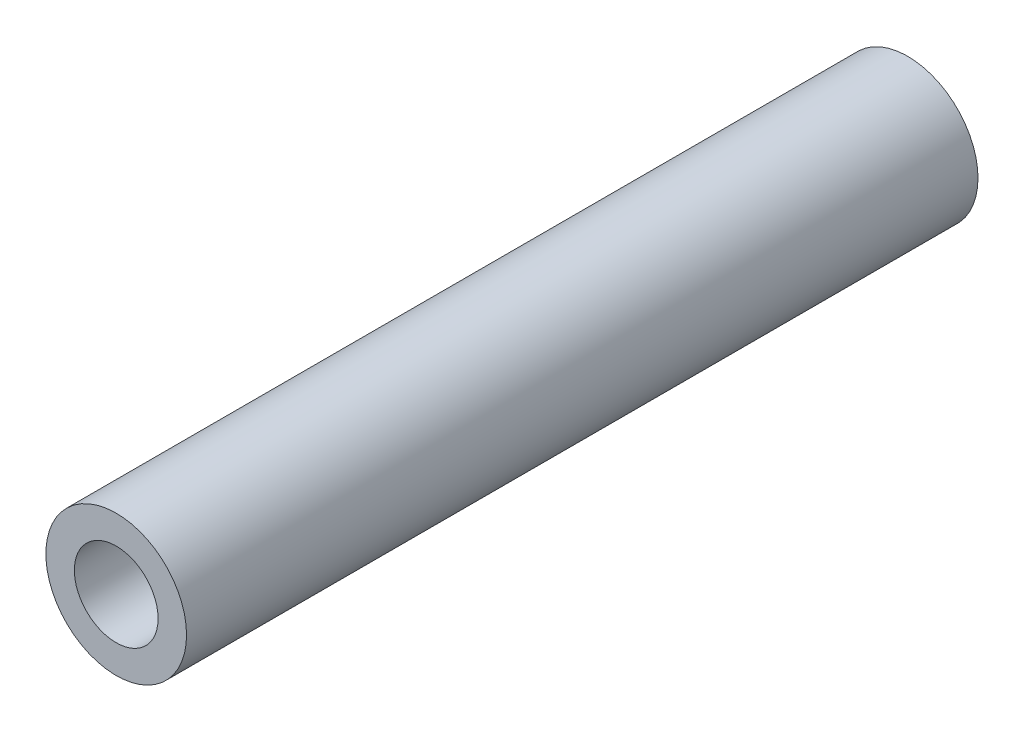
ISO-10303-21;
HEADER;
FILE_DESCRIPTION(('STEP AP214'),'2;1');
FILE_NAME('part.step','',(''),(''),'','','');
FILE_SCHEMA(('AUTOMOTIVE_DESIGN { 1 0 10303 214 1 1 1 1 }'));
ENDSEC;
DATA;
#1=APPLICATION_CONTEXT('core data for automotive mechanical design processes');
#2=APPLICATION_PROTOCOL_DEFINITION('international standard','automotive_design',2000,#1);
#3=PRODUCT_CONTEXT('',#1,'mechanical');
#4=PRODUCT('Part','Part','',(#3));
#5=PRODUCT_RELATED_PRODUCT_CATEGORY('part','',(#4));
#6=PRODUCT_DEFINITION_FORMATION('','',#4);
#7=PRODUCT_DEFINITION_CONTEXT('part definition',#1,'design');
#8=PRODUCT_DEFINITION('design','',#6,#7);
#9=PRODUCT_DEFINITION_SHAPE('','',#8);
#10=(LENGTH_UNIT() NAMED_UNIT(*) SI_UNIT(.MILLI.,.METRE.));
#11=(NAMED_UNIT(*) PLANE_ANGLE_UNIT() SI_UNIT($,.RADIAN.));
#12=(NAMED_UNIT(*) SI_UNIT($,.STERADIAN.) SOLID_ANGLE_UNIT());
#13=UNCERTAINTY_MEASURE_WITH_UNIT(LENGTH_MEASURE(1.E-05),#10,'distance_accuracy_value','');
#14=(GEOMETRIC_REPRESENTATION_CONTEXT(3) GLOBAL_UNCERTAINTY_ASSIGNED_CONTEXT((#13)) GLOBAL_UNIT_ASSIGNED_CONTEXT((#10,
#11,#12)) REPRESENTATION_CONTEXT('',''));
#15=CARTESIAN_POINT('',(0.,0.,0.));
#16=DIRECTION('',(0.,0.,1.));
#17=DIRECTION('',(1.,0.,0.));
#18=AXIS2_PLACEMENT_3D('',#15,#16,#17);
#19=CARTESIAN_POINT('',(0.,0.,120.));
#20=DIRECTION('',(0.,0.,1.));
#21=DIRECTION('',(1.,0.,0.));
#22=AXIS2_PLACEMENT_3D('',#19,#20,#21);
#23=PLANE('',#22);
#24=CARTESIAN_POINT('',(0.,0.,120.));
#25=DIRECTION('',(0.,0.,1.));
#26=DIRECTION('',(1.,0.,0.));
#27=AXIS2_PLACEMENT_3D('',#24,#25,#26);
#28=CIRCLE('',#27,10.665);
#29=CARTESIAN_POINT('',(10.665,0.,120.));
#30=VERTEX_POINT('',#29);
#31=EDGE_CURVE('E10',#30,#30,#28,.T.);
#32=ORIENTED_EDGE('',*,*,#31,.T.);
#33=EDGE_LOOP('',(#32));
#34=FACE_BOUND('',#33,.T.);
#35=CARTESIAN_POINT('',(0.,0.,120.));
#36=DIRECTION('',(0.,0.,1.));
#37=DIRECTION('',(1.,0.,0.));
#38=AXIS2_PLACEMENT_3D('',#35,#36,#37);
#39=CIRCLE('',#38,6.35);
#40=CARTESIAN_POINT('',(6.35,0.,120.));
#41=VERTEX_POINT('',#40);
#42=EDGE_CURVE('E56',#41,#41,#39,.T.);
#43=ORIENTED_EDGE('',*,*,#42,.F.);
#44=EDGE_LOOP('',(#43));
#45=FACE_BOUND('',#44,.T.);
#46=ADVANCED_FACE('F43',(#34,#45),#23,.T.);
#47=CARTESIAN_POINT('',(0.,0.,0.));
#48=DIRECTION('',(0.,0.,1.));
#49=DIRECTION('',(1.,0.,0.));
#50=AXIS2_PLACEMENT_3D('',#47,#48,#49);
#51=PLANE('',#50);
#52=CARTESIAN_POINT('',(0.,0.,0.));
#53=DIRECTION('',(0.,0.,1.));
#54=DIRECTION('',(1.,0.,0.));
#55=AXIS2_PLACEMENT_3D('',#52,#53,#54);
#56=CIRCLE('',#55,10.665);
#57=CARTESIAN_POINT('',(10.665,0.,0.));
#58=VERTEX_POINT('',#57);
#59=EDGE_CURVE('E47',#58,#58,#56,.T.);
#60=ORIENTED_EDGE('',*,*,#59,.F.);
#61=EDGE_LOOP('',(#60));
#62=FACE_BOUND('',#61,.T.);
#63=CARTESIAN_POINT('',(0.,0.,0.));
#64=DIRECTION('',(0.,0.,1.));
#65=DIRECTION('',(1.,0.,0.));
#66=AXIS2_PLACEMENT_3D('',#63,#64,#65);
#67=CIRCLE('',#66,6.35);
#68=CARTESIAN_POINT('',(6.35,0.,0.));
#69=VERTEX_POINT('',#68);
#70=EDGE_CURVE('E58',#69,#69,#67,.T.);
#71=ORIENTED_EDGE('',*,*,#70,.T.);
#72=EDGE_LOOP('',(#71));
#73=FACE_BOUND('',#72,.T.);
#74=ADVANCED_FACE('F70',(#62,#73),#51,.F.);
#75=CARTESIAN_POINT('',(0.,0.,120.));
#76=DIRECTION('',(0.,0.,-1.));
#77=DIRECTION('',(-1.,0.,0.));
#78=AXIS2_PLACEMENT_3D('',#75,#76,#77);
#79=CYLINDRICAL_SURFACE('',#78,10.665);
#80=ORIENTED_EDGE('',*,*,#31,.F.);
#81=EDGE_LOOP('',(#80));
#82=FACE_BOUND('',#81,.T.);
#83=ORIENTED_EDGE('',*,*,#59,.T.);
#84=EDGE_LOOP('',(#83));
#85=FACE_BOUND('',#84,.T.);
#86=ADVANCED_FACE('F45',(#82,#85),#79,.T.);
#87=CARTESIAN_POINT('',(0.,0.,120.));
#88=DIRECTION('',(0.,0.,-1.));
#89=DIRECTION('',(-1.,0.,0.));
#90=AXIS2_PLACEMENT_3D('',#87,#88,#89);
#91=CYLINDRICAL_SURFACE('',#90,6.35);
#92=ORIENTED_EDGE('',*,*,#42,.T.);
#93=EDGE_LOOP('',(#92));
#94=FACE_BOUND('',#93,.T.);
#95=ORIENTED_EDGE('',*,*,#70,.F.);
#96=EDGE_LOOP('',(#95));
#97=FACE_BOUND('',#96,.T.);
#98=ADVANCED_FACE('F66',(#94,#97),#91,.F.);
#99=CLOSED_SHELL('',(#46,#74,#86,#98));
#100=MANIFOLD_SOLID_BREP('B2',#99);
#101=ADVANCED_BREP_SHAPE_REPRESENTATION('',(#18,#100),#14);
#102=SHAPE_DEFINITION_REPRESENTATION(#9,#101);
ENDSEC;
END-ISO-10303-21;
